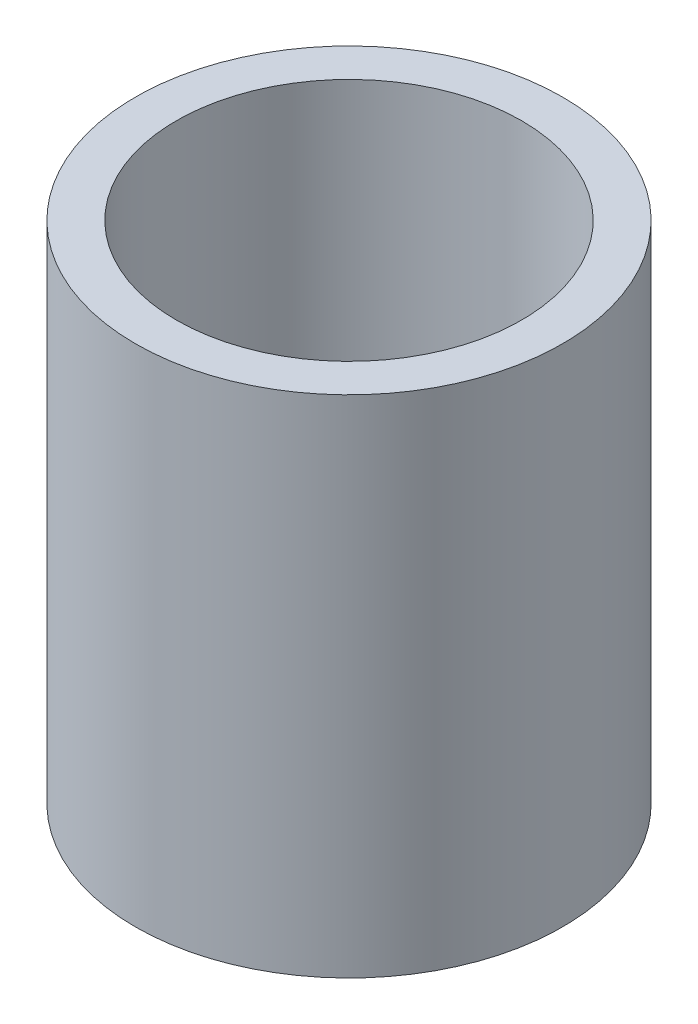
ISO-10303-21;
HEADER;
FILE_DESCRIPTION(('STEP AP214'),'2;1');
FILE_NAME('part.step','',(''),(''),'','','');
FILE_SCHEMA(('AUTOMOTIVE_DESIGN { 1 0 10303 214 1 1 1 1 }'));
ENDSEC;
DATA;
#1=APPLICATION_CONTEXT('core data for automotive mechanical design processes');
#2=APPLICATION_PROTOCOL_DEFINITION('international standard','automotive_design',2000,#1);
#3=PRODUCT_CONTEXT('',#1,'mechanical');
#4=PRODUCT('Part','Part','',(#3));
#5=PRODUCT_RELATED_PRODUCT_CATEGORY('part','',(#4));
#6=PRODUCT_DEFINITION_FORMATION('','',#4);
#7=PRODUCT_DEFINITION_CONTEXT('part definition',#1,'design');
#8=PRODUCT_DEFINITION('design','',#6,#7);
#9=PRODUCT_DEFINITION_SHAPE('','',#8);
#10=(LENGTH_UNIT() NAMED_UNIT(*) SI_UNIT(.MILLI.,.METRE.));
#11=(NAMED_UNIT(*) PLANE_ANGLE_UNIT() SI_UNIT($,.RADIAN.));
#12=(NAMED_UNIT(*) SI_UNIT($,.STERADIAN.) SOLID_ANGLE_UNIT());
#13=UNCERTAINTY_MEASURE_WITH_UNIT(LENGTH_MEASURE(1.E-05),#10,'distance_accuracy_value','');
#14=(GEOMETRIC_REPRESENTATION_CONTEXT(3) GLOBAL_UNCERTAINTY_ASSIGNED_CONTEXT((#13)) GLOBAL_UNIT_ASSIGNED_CONTEXT((#10,
#11,#12)) REPRESENTATION_CONTEXT('',''));
#15=CARTESIAN_POINT('',(0.,0.,0.));
#16=DIRECTION('',(0.,0.,1.));
#17=DIRECTION('',(1.,0.,0.));
#18=AXIS2_PLACEMENT_3D('',#15,#16,#17);
#19=CARTESIAN_POINT('',(0.,0.,0.));
#20=DIRECTION('',(0.,1.,0.));
#21=DIRECTION('',(0.,0.,1.));
#22=AXIS2_PLACEMENT_3D('',#19,#20,#21);
#23=PLANE('',#22);
#24=CARTESIAN_POINT('',(0.,0.,0.));
#25=DIRECTION('',(0.,1.,0.));
#26=DIRECTION('',(0.,0.,1.));
#27=AXIS2_PLACEMENT_3D('',#24,#25,#26);
#28=CIRCLE('',#27,6.325);
#29=CARTESIAN_POINT('',(0.,0.,6.325));
#30=VERTEX_POINT('',#29);
#31=EDGE_CURVE('E137',#30,#30,#28,.T.);
#32=ORIENTED_EDGE('',*,*,#31,.T.);
#33=EDGE_LOOP('',(#32));
#34=FACE_BOUND('',#33,.T.);
#35=DIRECTION('',(-1.,0.,0.));
#36=VECTOR('',#35,1.);
#37=CARTESIAN_POINT('',(-2.,0.,1.525));
#38=LINE('',#37,#36);
#39=CARTESIAN_POINT('',(2.,0.,1.525));
#40=VERTEX_POINT('',#39);
#41=CARTESIAN_POINT('',(-2.,0.,1.525));
#42=VERTEX_POINT('',#41);
#43=EDGE_CURVE('E96',#40,#42,#38,.T.);
#44=ORIENTED_EDGE('',*,*,#43,.T.);
#45=CARTESIAN_POINT('',(-2.,0.,0.));
#46=DIRECTION('',(0.,-1.,0.));
#47=DIRECTION('',(0.,0.,-1.));
#48=AXIS2_PLACEMENT_3D('',#45,#46,#47);
#49=CIRCLE('',#48,1.525);
#50=CARTESIAN_POINT('',(-2.,0.,-1.525));
#51=VERTEX_POINT('',#50);
#52=EDGE_CURVE('E89',#42,#51,#49,.T.);
#53=ORIENTED_EDGE('',*,*,#52,.T.);
#54=DIRECTION('',(1.,0.,0.));
#55=VECTOR('',#54,1.);
#56=CARTESIAN_POINT('',(-2.,0.,-1.525));
#57=LINE('',#56,#55);
#58=CARTESIAN_POINT('',(2.,0.,-1.525));
#59=VERTEX_POINT('',#58);
#60=EDGE_CURVE('E99',#51,#59,#57,.T.);
#61=ORIENTED_EDGE('',*,*,#60,.T.);
#62=CARTESIAN_POINT('',(2.,0.,0.));
#63=DIRECTION('',(0.,-1.,0.));
#64=DIRECTION('',(0.,0.,-1.));
#65=AXIS2_PLACEMENT_3D('',#62,#63,#64);
#66=CIRCLE('',#65,1.525);
#67=EDGE_CURVE('E61',#59,#40,#66,.T.);
#68=ORIENTED_EDGE('',*,*,#67,.T.);
#69=EDGE_LOOP('',(#44,#53,#61,#68));
#70=FACE_BOUND('',#69,.T.);
#71=ADVANCED_FACE('F45',(#34,#70),#23,.T.);
#72=CARTESIAN_POINT('',(0.,12.75,0.));
#73=DIRECTION('',(0.,1.,0.));
#74=DIRECTION('',(0.,0.,1.));
#75=AXIS2_PLACEMENT_3D('',#72,#73,#74);
#76=PLANE('',#75);
#77=CARTESIAN_POINT('',(0.,12.75,0.));
#78=DIRECTION('',(0.,1.,0.));
#79=DIRECTION('',(0.,0.,1.));
#80=AXIS2_PLACEMENT_3D('',#77,#78,#79);
#81=CIRCLE('',#80,7.825);
#82=CARTESIAN_POINT('',(0.,12.75,7.825));
#83=VERTEX_POINT('',#82);
#84=EDGE_CURVE('E11',#83,#83,#81,.T.);
#85=ORIENTED_EDGE('',*,*,#84,.T.);
#86=EDGE_LOOP('',(#85));
#87=FACE_BOUND('',#86,.T.);
#88=CARTESIAN_POINT('',(0.,12.75,0.));
#89=DIRECTION('',(0.,1.,0.));
#90=DIRECTION('',(0.,0.,1.));
#91=AXIS2_PLACEMENT_3D('',#88,#89,#90);
#92=CIRCLE('',#91,6.325);
#93=CARTESIAN_POINT('',(0.,12.75,6.325));
#94=VERTEX_POINT('',#93);
#95=EDGE_CURVE('E54',#94,#94,#92,.T.);
#96=ORIENTED_EDGE('',*,*,#95,.F.);
#97=EDGE_LOOP('',(#96));
#98=FACE_BOUND('',#97,.T.);
#99=ADVANCED_FACE('F157',(#87,#98),#76,.T.);
#100=CARTESIAN_POINT('',(0.,12.75,0.));
#101=DIRECTION('',(0.,-1.,0.));
#102=DIRECTION('',(0.,0.,-1.));
#103=AXIS2_PLACEMENT_3D('',#100,#101,#102);
#104=CYLINDRICAL_SURFACE('',#103,7.825);
#105=ORIENTED_EDGE('',*,*,#84,.F.);
#106=EDGE_LOOP('',(#105));
#107=FACE_BOUND('',#106,.T.);
#108=CARTESIAN_POINT('',(0.,-5.75,0.));
#109=DIRECTION('',(0.,1.,0.));
#110=DIRECTION('',(0.,0.,1.));
#111=AXIS2_PLACEMENT_3D('',#108,#109,#110);
#112=CIRCLE('',#111,7.825);
#113=CARTESIAN_POINT('',(0.,-5.75,7.825));
#114=VERTEX_POINT('',#113);
#115=EDGE_CURVE('E128',#114,#114,#112,.T.);
#116=ORIENTED_EDGE('',*,*,#115,.T.);
#117=EDGE_LOOP('',(#116));
#118=FACE_BOUND('',#117,.T.);
#119=ADVANCED_FACE('F47',(#107,#118),#104,.T.);
#120=CARTESIAN_POINT('',(0.,12.75,0.));
#121=DIRECTION('',(0.,-1.,0.));
#122=DIRECTION('',(0.,0.,-1.));
#123=AXIS2_PLACEMENT_3D('',#120,#121,#122);
#124=CYLINDRICAL_SURFACE('',#123,6.325);
#125=ORIENTED_EDGE('',*,*,#95,.T.);
#126=EDGE_LOOP('',(#125));
#127=FACE_BOUND('',#126,.T.);
#128=ORIENTED_EDGE('',*,*,#31,.F.);
#129=EDGE_LOOP('',(#128));
#130=FACE_BOUND('',#129,.T.);
#131=ADVANCED_FACE('F145',(#127,#130),#124,.F.);
#132=CARTESIAN_POINT('',(0.,-5.75,0.));
#133=DIRECTION('',(0.,1.,0.));
#134=DIRECTION('',(0.,0.,1.));
#135=AXIS2_PLACEMENT_3D('',#132,#133,#134);
#136=PLANE('',#135);
#137=DIRECTION('',(1.,0.,0.));
#138=VECTOR('',#137,1.);
#139=CARTESIAN_POINT('',(-2.,-5.75,-1.525));
#140=LINE('',#139,#138);
#141=CARTESIAN_POINT('',(-2.,-5.75,-1.525));
#142=VERTEX_POINT('',#141);
#143=CARTESIAN_POINT('',(2.,-5.75,-1.525));
#144=VERTEX_POINT('',#143);
#145=EDGE_CURVE('E119',#142,#144,#140,.T.);
#146=ORIENTED_EDGE('',*,*,#145,.F.);
#147=CARTESIAN_POINT('',(-2.,-5.75,0.));
#148=DIRECTION('',(0.,-1.,0.));
#149=DIRECTION('',(0.,0.,-1.));
#150=AXIS2_PLACEMENT_3D('',#147,#148,#149);
#151=CIRCLE('',#150,1.525);
#152=CARTESIAN_POINT('',(-2.,-5.75,1.525));
#153=VERTEX_POINT('',#152);
#154=EDGE_CURVE('E69',#153,#142,#151,.T.);
#155=ORIENTED_EDGE('',*,*,#154,.F.);
#156=DIRECTION('',(-1.,0.,0.));
#157=VECTOR('',#156,1.);
#158=CARTESIAN_POINT('',(-2.,-5.75,1.525));
#159=LINE('',#158,#157);
#160=CARTESIAN_POINT('',(2.,-5.75,1.525));
#161=VERTEX_POINT('',#160);
#162=EDGE_CURVE('E106',#161,#153,#159,.T.);
#163=ORIENTED_EDGE('',*,*,#162,.F.);
#164=CARTESIAN_POINT('',(2.,-5.75,0.));
#165=DIRECTION('',(0.,-1.,0.));
#166=DIRECTION('',(0.,0.,-1.));
#167=AXIS2_PLACEMENT_3D('',#164,#165,#166);
#168=CIRCLE('',#167,1.525);
#169=EDGE_CURVE('E110',#144,#161,#168,.T.);
#170=ORIENTED_EDGE('',*,*,#169,.F.);
#171=EDGE_LOOP('',(#146,#155,#163,#170));
#172=FACE_BOUND('',#171,.T.);
#173=ORIENTED_EDGE('',*,*,#115,.F.);
#174=EDGE_LOOP('',(#173));
#175=FACE_BOUND('',#174,.T.);
#176=ADVANCED_FACE('F147',(#172,#175),#136,.F.);
#177=CARTESIAN_POINT('',(-2.,0.,0.));
#178=DIRECTION('',(0.,-1.,0.));
#179=DIRECTION('',(0.,0.,-1.));
#180=AXIS2_PLACEMENT_3D('',#177,#178,#179);
#181=CYLINDRICAL_SURFACE('',#180,1.525);
#182=ORIENTED_EDGE('',*,*,#154,.T.);
#183=DIRECTION('',(0.,-1.,0.));
#184=VECTOR('',#183,1.);
#185=CARTESIAN_POINT('',(-2.,0.,-1.525));
#186=LINE('',#185,#184);
#187=EDGE_CURVE('E85',#51,#142,#186,.T.);
#188=ORIENTED_EDGE('',*,*,#187,.F.);
#189=ORIENTED_EDGE('',*,*,#52,.F.);
#190=DIRECTION('',(0.,-1.,0.));
#191=VECTOR('',#190,1.);
#192=CARTESIAN_POINT('',(-2.,0.,1.525));
#193=LINE('',#192,#191);
#194=EDGE_CURVE('E125',#42,#153,#193,.T.);
#195=ORIENTED_EDGE('',*,*,#194,.T.);
#196=EDGE_LOOP('',(#182,#188,#189,#195));
#197=FACE_BOUND('',#196,.T.);
#198=ADVANCED_FACE('F87',(#197),#181,.F.);
#199=CARTESIAN_POINT('',(-2.,0.,1.525));
#200=DIRECTION('',(0.,0.,1.));
#201=DIRECTION('',(1.,0.,0.));
#202=AXIS2_PLACEMENT_3D('',#199,#200,#201);
#203=PLANE('',#202);
#204=ORIENTED_EDGE('',*,*,#162,.T.);
#205=ORIENTED_EDGE('',*,*,#194,.F.);
#206=ORIENTED_EDGE('',*,*,#43,.F.);
#207=DIRECTION('',(0.,-1.,0.));
#208=VECTOR('',#207,1.);
#209=CARTESIAN_POINT('',(2.,0.,1.525));
#210=LINE('',#209,#208);
#211=EDGE_CURVE('E129',#40,#161,#210,.T.);
#212=ORIENTED_EDGE('',*,*,#211,.T.);
#213=EDGE_LOOP('',(#204,#205,#206,#212));
#214=FACE_BOUND('',#213,.T.);
#215=ADVANCED_FACE('F167',(#214),#203,.F.);
#216=CARTESIAN_POINT('',(2.,0.,0.));
#217=DIRECTION('',(0.,-1.,0.));
#218=DIRECTION('',(0.,0.,-1.));
#219=AXIS2_PLACEMENT_3D('',#216,#217,#218);
#220=CYLINDRICAL_SURFACE('',#219,1.525);
#221=ORIENTED_EDGE('',*,*,#169,.T.);
#222=ORIENTED_EDGE('',*,*,#211,.F.);
#223=ORIENTED_EDGE('',*,*,#67,.F.);
#224=DIRECTION('',(0.,-1.,0.));
#225=VECTOR('',#224,1.);
#226=CARTESIAN_POINT('',(2.,0.,-1.525));
#227=LINE('',#226,#225);
#228=EDGE_CURVE('E95',#59,#144,#227,.T.);
#229=ORIENTED_EDGE('',*,*,#228,.T.);
#230=EDGE_LOOP('',(#221,#222,#223,#229));
#231=FACE_BOUND('',#230,.T.);
#232=ADVANCED_FACE('F170',(#231),#220,.F.);
#233=CARTESIAN_POINT('',(-2.,0.,-1.525));
#234=DIRECTION('',(0.,0.,-1.));
#235=DIRECTION('',(-1.,0.,0.));
#236=AXIS2_PLACEMENT_3D('',#233,#234,#235);
#237=PLANE('',#236);
#238=ORIENTED_EDGE('',*,*,#145,.T.);
#239=ORIENTED_EDGE('',*,*,#228,.F.);
#240=ORIENTED_EDGE('',*,*,#60,.F.);
#241=ORIENTED_EDGE('',*,*,#187,.T.);
#242=EDGE_LOOP('',(#238,#239,#240,#241));
#243=FACE_BOUND('',#242,.T.);
#244=ADVANCED_FACE('F100',(#243),#237,.F.);
#245=CLOSED_SHELL('',(#71,#99,#119,#131,#176,#198,#215,#232,#244));
#246=MANIFOLD_SOLID_BREP('B2',#245);
#247=ADVANCED_BREP_SHAPE_REPRESENTATION('',(#18,#246),#14);
#248=SHAPE_DEFINITION_REPRESENTATION(#9,#247);
ENDSEC;
END-ISO-10303-21;
